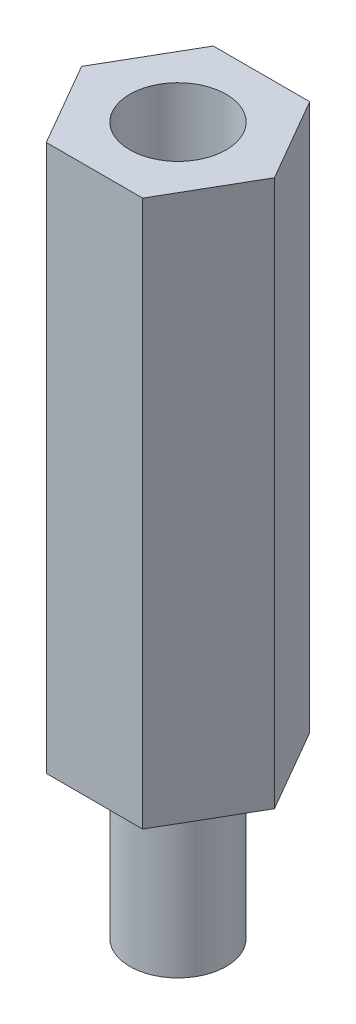
ISO-10303-21;
HEADER;
FILE_DESCRIPTION(('STEP AP214'),'2;1');
FILE_NAME('part.step','',(''),(''),'','','');
FILE_SCHEMA(('AUTOMOTIVE_DESIGN { 1 0 10303 214 1 1 1 1 }'));
ENDSEC;
DATA;
#1=APPLICATION_CONTEXT('core data for automotive mechanical design processes');
#2=APPLICATION_PROTOCOL_DEFINITION('international standard','automotive_design',2000,#1);
#3=PRODUCT_CONTEXT('',#1,'mechanical');
#4=PRODUCT('Part','Part','',(#3));
#5=PRODUCT_RELATED_PRODUCT_CATEGORY('part','',(#4));
#6=PRODUCT_DEFINITION_FORMATION('','',#4);
#7=PRODUCT_DEFINITION_CONTEXT('part definition',#1,'design');
#8=PRODUCT_DEFINITION('design','',#6,#7);
#9=PRODUCT_DEFINITION_SHAPE('','',#8);
#10=(LENGTH_UNIT() NAMED_UNIT(*) SI_UNIT(.MILLI.,.METRE.));
#11=(NAMED_UNIT(*) PLANE_ANGLE_UNIT() SI_UNIT($,.RADIAN.));
#12=(NAMED_UNIT(*) SI_UNIT($,.STERADIAN.) SOLID_ANGLE_UNIT());
#13=UNCERTAINTY_MEASURE_WITH_UNIT(LENGTH_MEASURE(1.E-05),#10,'distance_accuracy_value','');
#14=(GEOMETRIC_REPRESENTATION_CONTEXT(3) GLOBAL_UNCERTAINTY_ASSIGNED_CONTEXT((#13)) GLOBAL_UNIT_ASSIGNED_CONTEXT((#10,
#11,#12)) REPRESENTATION_CONTEXT('',''));
#15=CARTESIAN_POINT('',(0.,0.,0.));
#16=DIRECTION('',(0.,0.,1.));
#17=DIRECTION('',(1.,0.,0.));
#18=AXIS2_PLACEMENT_3D('',#15,#16,#17);
#19=CARTESIAN_POINT('',(0.,15.,0.));
#20=DIRECTION('',(0.,1.,0.));
#21=DIRECTION('',(0.,0.,1.));
#22=AXIS2_PLACEMENT_3D('',#19,#20,#21);
#23=PLANE('',#22);
#24=DIRECTION('',(0.499999999999999,0.,-0.866025403784439));
#25=VECTOR('',#24,1.);
#26=CARTESIAN_POINT('',(1.5,15.,2.59807621135332));
#27=LINE('',#26,#25);
#28=CARTESIAN_POINT('',(1.5,15.,2.59807621135332));
#29=VERTEX_POINT('',#28);
#30=CARTESIAN_POINT('',(3.,15.,0.));
#31=VERTEX_POINT('',#30);
#32=EDGE_CURVE('E96',#29,#31,#27,.T.);
#33=ORIENTED_EDGE('',*,*,#32,.T.);
#34=DIRECTION('',(-0.5,0.,-0.866025403784439));
#35=VECTOR('',#34,1.);
#36=CARTESIAN_POINT('',(3.,15.,0.));
#37=LINE('',#36,#35);
#38=CARTESIAN_POINT('',(1.5,15.,-2.59807621135332));
#39=VERTEX_POINT('',#38);
#40=EDGE_CURVE('E132',#31,#39,#37,.T.);
#41=ORIENTED_EDGE('',*,*,#40,.T.);
#42=DIRECTION('',(-1.,0.,0.));
#43=VECTOR('',#42,1.);
#44=CARTESIAN_POINT('',(1.5,15.,-2.59807621135332));
#45=LINE('',#44,#43);
#46=CARTESIAN_POINT('',(-1.5,15.,-2.59807621135332));
#47=VERTEX_POINT('',#46);
#48=EDGE_CURVE('E134',#39,#47,#45,.T.);
#49=ORIENTED_EDGE('',*,*,#48,.T.);
#50=DIRECTION('',(-0.5,0.,0.866025403784439));
#51=VECTOR('',#50,1.);
#52=CARTESIAN_POINT('',(-1.5,15.,-2.59807621135332));
#53=LINE('',#52,#51);
#54=CARTESIAN_POINT('',(-3.,15.,0.));
#55=VERTEX_POINT('',#54);
#56=EDGE_CURVE('E136',#47,#55,#53,.T.);
#57=ORIENTED_EDGE('',*,*,#56,.T.);
#58=DIRECTION('',(0.5,0.,0.866025403784438));
#59=VECTOR('',#58,1.);
#60=CARTESIAN_POINT('',(-3.,15.,0.));
#61=LINE('',#60,#59);
#62=CARTESIAN_POINT('',(-1.5,15.,2.59807621135332));
#63=VERTEX_POINT('',#62);
#64=EDGE_CURVE('E58',#55,#63,#61,.T.);
#65=ORIENTED_EDGE('',*,*,#64,.T.);
#66=DIRECTION('',(1.,0.,0.));
#67=VECTOR('',#66,1.);
#68=CARTESIAN_POINT('',(-1.5,15.,2.59807621135332));
#69=LINE('',#68,#67);
#70=EDGE_CURVE('E53',#63,#29,#69,.T.);
#71=ORIENTED_EDGE('',*,*,#70,.T.);
#72=EDGE_LOOP('',(#33,#41,#49,#57,#65,#71));
#73=FACE_BOUND('',#72,.T.);
#74=CARTESIAN_POINT('',(0.,15.,0.));
#75=DIRECTION('',(0.,1.,0.));
#76=DIRECTION('',(0.,0.,1.));
#77=AXIS2_PLACEMENT_3D('',#74,#75,#76);
#78=CIRCLE('',#77,1.5);
#79=CARTESIAN_POINT('',(0.,15.,1.5));
#80=VERTEX_POINT('',#79);
#81=EDGE_CURVE('E126',#80,#80,#78,.T.);
#82=ORIENTED_EDGE('',*,*,#81,.F.);
#83=EDGE_LOOP('',(#82));
#84=FACE_BOUND('',#83,.T.);
#85=ADVANCED_FACE('F37',(#73,#84),#23,.T.);
#86=CARTESIAN_POINT('',(1.5,15.,2.59807621135332));
#87=DIRECTION('',(-0.866025403784439,0.,-0.499999999999999));
#88=DIRECTION('',(-0.499999999999999,0.,0.866025403784439));
#89=AXIS2_PLACEMENT_3D('',#86,#87,#88);
#90=PLANE('',#89);
#91=DIRECTION('',(0.,-1.,0.));
#92=VECTOR('',#91,1.);
#93=CARTESIAN_POINT('',(1.5,15.,2.59807621135332));
#94=LINE('',#93,#92);
#95=CARTESIAN_POINT('',(1.5,-2.,2.59807621135332));
#96=VERTEX_POINT('',#95);
#97=EDGE_CURVE('E91',#29,#96,#94,.T.);
#98=ORIENTED_EDGE('',*,*,#97,.T.);
#99=DIRECTION('',(-0.500000000000005,0.,0.866025403784436));
#100=VECTOR('',#99,1.);
#101=CARTESIAN_POINT('',(3.,-2.,0.));
#102=LINE('',#101,#100);
#103=CARTESIAN_POINT('',(3.,-2.,0.));
#104=VERTEX_POINT('',#103);
#105=EDGE_CURVE('E95',#104,#96,#102,.T.);
#106=ORIENTED_EDGE('',*,*,#105,.F.);
#107=DIRECTION('',(0.,-1.,0.));
#108=VECTOR('',#107,1.);
#109=CARTESIAN_POINT('',(3.,15.,0.));
#110=LINE('',#109,#108);
#111=EDGE_CURVE('E41',#31,#104,#110,.T.);
#112=ORIENTED_EDGE('',*,*,#111,.F.);
#113=ORIENTED_EDGE('',*,*,#32,.F.);
#114=EDGE_LOOP('',(#98,#106,#112,#113));
#115=FACE_BOUND('',#114,.T.);
#116=ADVANCED_FACE('F39',(#115),#90,.F.);
#117=CARTESIAN_POINT('',(3.,15.,0.));
#118=DIRECTION('',(-0.866025403784439,0.,0.5));
#119=DIRECTION('',(0.5,0.,0.866025403784439));
#120=AXIS2_PLACEMENT_3D('',#117,#118,#119);
#121=PLANE('',#120);
#122=ORIENTED_EDGE('',*,*,#111,.T.);
#123=DIRECTION('',(0.499999999999991,0.,0.866025403784444));
#124=VECTOR('',#123,1.);
#125=CARTESIAN_POINT('',(1.50000000000002,-2.,-2.5980762113533));
#126=LINE('',#125,#124);
#127=CARTESIAN_POINT('',(1.50000000000002,-2.,-2.5980762113533));
#128=VERTEX_POINT('',#127);
#129=EDGE_CURVE('E112',#128,#104,#126,.T.);
#130=ORIENTED_EDGE('',*,*,#129,.F.);
#131=DIRECTION('',(0.,-1.,0.));
#132=VECTOR('',#131,1.);
#133=CARTESIAN_POINT('',(1.5,15.,-2.59807621135332));
#134=LINE('',#133,#132);
#135=EDGE_CURVE('E144',#39,#128,#134,.T.);
#136=ORIENTED_EDGE('',*,*,#135,.F.);
#137=ORIENTED_EDGE('',*,*,#40,.F.);
#138=EDGE_LOOP('',(#122,#130,#136,#137));
#139=FACE_BOUND('',#138,.T.);
#140=ADVANCED_FACE('F150',(#139),#121,.F.);
#141=CARTESIAN_POINT('',(1.5,15.,-2.59807621135332));
#142=DIRECTION('',(0.,0.,1.));
#143=DIRECTION('',(1.,0.,0.));
#144=AXIS2_PLACEMENT_3D('',#141,#142,#143);
#145=PLANE('',#144);
#146=ORIENTED_EDGE('',*,*,#135,.T.);
#147=DIRECTION('',(1.,0.,0.));
#148=VECTOR('',#147,1.);
#149=CARTESIAN_POINT('',(-1.49999999999998,-2.,-2.59807621135333));
#150=LINE('',#149,#148);
#151=CARTESIAN_POINT('',(-1.49999999999998,-2.,-2.59807621135333));
#152=VERTEX_POINT('',#151);
#153=EDGE_CURVE('E122',#152,#128,#150,.T.);
#154=ORIENTED_EDGE('',*,*,#153,.F.);
#155=DIRECTION('',(0.,-1.,0.));
#156=VECTOR('',#155,1.);
#157=CARTESIAN_POINT('',(-1.5,15.,-2.59807621135332));
#158=LINE('',#157,#156);
#159=EDGE_CURVE('E143',#47,#152,#158,.T.);
#160=ORIENTED_EDGE('',*,*,#159,.F.);
#161=ORIENTED_EDGE('',*,*,#48,.F.);
#162=EDGE_LOOP('',(#146,#154,#160,#161));
#163=FACE_BOUND('',#162,.T.);
#164=ADVANCED_FACE('F182',(#163),#145,.F.);
#165=CARTESIAN_POINT('',(-1.5,15.,-2.59807621135332));
#166=DIRECTION('',(0.866025403784439,0.,0.5));
#167=DIRECTION('',(0.5,0.,-0.866025403784439));
#168=AXIS2_PLACEMENT_3D('',#165,#166,#167);
#169=PLANE('',#168);
#170=ORIENTED_EDGE('',*,*,#159,.T.);
#171=DIRECTION('',(0.500000000000005,0.,-0.866025403784436));
#172=VECTOR('',#171,1.);
#173=CARTESIAN_POINT('',(-3.,-2.,0.));
#174=LINE('',#173,#172);
#175=CARTESIAN_POINT('',(-3.,-2.,0.));
#176=VERTEX_POINT('',#175);
#177=EDGE_CURVE('E119',#176,#152,#174,.T.);
#178=ORIENTED_EDGE('',*,*,#177,.F.);
#179=DIRECTION('',(0.,-1.,0.));
#180=VECTOR('',#179,1.);
#181=CARTESIAN_POINT('',(-3.,15.,0.));
#182=LINE('',#181,#180);
#183=EDGE_CURVE('E141',#55,#176,#182,.T.);
#184=ORIENTED_EDGE('',*,*,#183,.F.);
#185=ORIENTED_EDGE('',*,*,#56,.F.);
#186=EDGE_LOOP('',(#170,#178,#184,#185));
#187=FACE_BOUND('',#186,.T.);
#188=ADVANCED_FACE('F178',(#187),#169,.F.);
#189=CARTESIAN_POINT('',(-3.,15.,0.));
#190=DIRECTION('',(0.866025403784439,0.,-0.5));
#191=DIRECTION('',(-0.5,0.,-0.866025403784439));
#192=AXIS2_PLACEMENT_3D('',#189,#190,#191);
#193=PLANE('',#192);
#194=ORIENTED_EDGE('',*,*,#183,.T.);
#195=DIRECTION('',(-0.499999999999997,0.,-0.86602540378444));
#196=VECTOR('',#195,1.);
#197=CARTESIAN_POINT('',(-1.50000000000001,-2.,2.59807621135331));
#198=LINE('',#197,#196);
#199=CARTESIAN_POINT('',(-1.50000000000001,-2.,2.59807621135331));
#200=VERTEX_POINT('',#199);
#201=EDGE_CURVE('E106',#200,#176,#198,.T.);
#202=ORIENTED_EDGE('',*,*,#201,.F.);
#203=DIRECTION('',(0.,-1.,0.));
#204=VECTOR('',#203,1.);
#205=CARTESIAN_POINT('',(-1.5,15.,2.59807621135332));
#206=LINE('',#205,#204);
#207=EDGE_CURVE('E98',#63,#200,#206,.T.);
#208=ORIENTED_EDGE('',*,*,#207,.F.);
#209=ORIENTED_EDGE('',*,*,#64,.F.);
#210=EDGE_LOOP('',(#194,#202,#208,#209));
#211=FACE_BOUND('',#210,.T.);
#212=ADVANCED_FACE('F175',(#211),#193,.F.);
#213=CARTESIAN_POINT('',(-1.5,15.,2.59807621135332));
#214=DIRECTION('',(0.,0.,-1.));
#215=DIRECTION('',(-1.,0.,0.));
#216=AXIS2_PLACEMENT_3D('',#213,#214,#215);
#217=PLANE('',#216);
#218=ORIENTED_EDGE('',*,*,#207,.T.);
#219=DIRECTION('',(-1.,0.,0.));
#220=VECTOR('',#219,1.);
#221=CARTESIAN_POINT('',(1.5,-2.,2.59807621135332));
#222=LINE('',#221,#220);
#223=EDGE_CURVE('E101',#96,#200,#222,.T.);
#224=ORIENTED_EDGE('',*,*,#223,.F.);
#225=ORIENTED_EDGE('',*,*,#97,.F.);
#226=ORIENTED_EDGE('',*,*,#70,.F.);
#227=EDGE_LOOP('',(#218,#224,#225,#226));
#228=FACE_BOUND('',#227,.T.);
#229=ADVANCED_FACE('F102',(#228),#217,.F.);
#230=CARTESIAN_POINT('',(0.,15.,0.));
#231=DIRECTION('',(0.,-1.,0.));
#232=DIRECTION('',(0.,0.,-1.));
#233=AXIS2_PLACEMENT_3D('',#230,#231,#232);
#234=CYLINDRICAL_SURFACE('',#233,1.5);
#235=ORIENTED_EDGE('',*,*,#81,.T.);
#236=EDGE_LOOP('',(#235));
#237=FACE_BOUND('',#236,.T.);
#238=CARTESIAN_POINT('',(0.,0.,0.));
#239=DIRECTION('',(0.,1.,0.));
#240=DIRECTION('',(0.,0.,1.));
#241=AXIS2_PLACEMENT_3D('',#238,#239,#240);
#242=CIRCLE('',#241,1.5);
#243=CARTESIAN_POINT('',(0.,0.,1.5));
#244=VERTEX_POINT('',#243);
#245=EDGE_CURVE('E125',#244,#244,#242,.T.);
#246=ORIENTED_EDGE('',*,*,#245,.F.);
#247=EDGE_LOOP('',(#246));
#248=FACE_BOUND('',#247,.T.);
#249=ADVANCED_FACE('F156',(#237,#248),#234,.F.);
#250=CARTESIAN_POINT('',(0.,0.,0.));
#251=DIRECTION('',(0.,-1.,0.));
#252=DIRECTION('',(0.,0.,-1.));
#253=AXIS2_PLACEMENT_3D('',#250,#251,#252);
#254=PLANE('',#253);
#255=ORIENTED_EDGE('',*,*,#245,.T.);
#256=EDGE_LOOP('',(#255));
#257=FACE_BOUND('',#256,.T.);
#258=ADVANCED_FACE('F159',(#257),#254,.F.);
#259=CARTESIAN_POINT('',(0.,-2.,0.));
#260=DIRECTION('',(0.,-1.,0.));
#261=DIRECTION('',(0.,0.,-1.));
#262=AXIS2_PLACEMENT_3D('',#259,#260,#261);
#263=PLANE('',#262);
#264=CARTESIAN_POINT('',(0.,-2.,0.));
#265=DIRECTION('',(0.,-1.,0.));
#266=DIRECTION('',(0.,0.,-1.));
#267=AXIS2_PLACEMENT_3D('',#264,#265,#266);
#268=CIRCLE('',#267,1.5);
#269=CARTESIAN_POINT('',(0.,-2.,-1.5));
#270=VERTEX_POINT('',#269);
#271=EDGE_CURVE('E11',#270,#270,#268,.T.);
#272=ORIENTED_EDGE('',*,*,#271,.F.);
#273=EDGE_LOOP('',(#272));
#274=FACE_BOUND('',#273,.T.);
#275=ORIENTED_EDGE('',*,*,#105,.T.);
#276=ORIENTED_EDGE('',*,*,#223,.T.);
#277=ORIENTED_EDGE('',*,*,#201,.T.);
#278=ORIENTED_EDGE('',*,*,#177,.T.);
#279=ORIENTED_EDGE('',*,*,#153,.T.);
#280=ORIENTED_EDGE('',*,*,#129,.T.);
#281=EDGE_LOOP('',(#275,#276,#277,#278,#279,#280));
#282=FACE_BOUND('',#281,.T.);
#283=ADVANCED_FACE('F109',(#274,#282),#263,.T.);
#284=CARTESIAN_POINT('',(0.,-7.,0.));
#285=DIRECTION('',(0.,1.,0.));
#286=DIRECTION('',(0.,0.,1.));
#287=AXIS2_PLACEMENT_3D('',#284,#285,#286);
#288=CYLINDRICAL_SURFACE('',#287,1.5);
#289=CARTESIAN_POINT('',(0.,-7.,0.));
#290=DIRECTION('',(0.,-1.,0.));
#291=DIRECTION('',(0.,0.,-1.));
#292=AXIS2_PLACEMENT_3D('',#289,#290,#291);
#293=CIRCLE('',#292,1.5);
#294=CARTESIAN_POINT('',(0.,-7.,-1.5));
#295=VERTEX_POINT('',#294);
#296=EDGE_CURVE('E113',#295,#295,#293,.T.);
#297=ORIENTED_EDGE('',*,*,#296,.F.);
#298=EDGE_LOOP('',(#297));
#299=FACE_BOUND('',#298,.T.);
#300=ORIENTED_EDGE('',*,*,#271,.T.);
#301=EDGE_LOOP('',(#300));
#302=FACE_BOUND('',#301,.T.);
#303=ADVANCED_FACE('F168',(#299,#302),#288,.T.);
#304=CARTESIAN_POINT('',(0.,-7.,0.));
#305=DIRECTION('',(0.,-1.,0.));
#306=DIRECTION('',(0.,0.,-1.));
#307=AXIS2_PLACEMENT_3D('',#304,#305,#306);
#308=PLANE('',#307);
#309=ORIENTED_EDGE('',*,*,#296,.T.);
#310=EDGE_LOOP('',(#309));
#311=FACE_BOUND('',#310,.T.);
#312=ADVANCED_FACE('F268',(#311),#308,.T.);
#313=CLOSED_SHELL('',(#85,#116,#140,#164,#188,#212,#229,#249,#258,#283,#303,#312));
#314=MANIFOLD_SOLID_BREP('B2',#313);
#315=ADVANCED_BREP_SHAPE_REPRESENTATION('',(#18,#314),#14);
#316=SHAPE_DEFINITION_REPRESENTATION(#9,#315);
ENDSEC;
END-ISO-10303-21;
